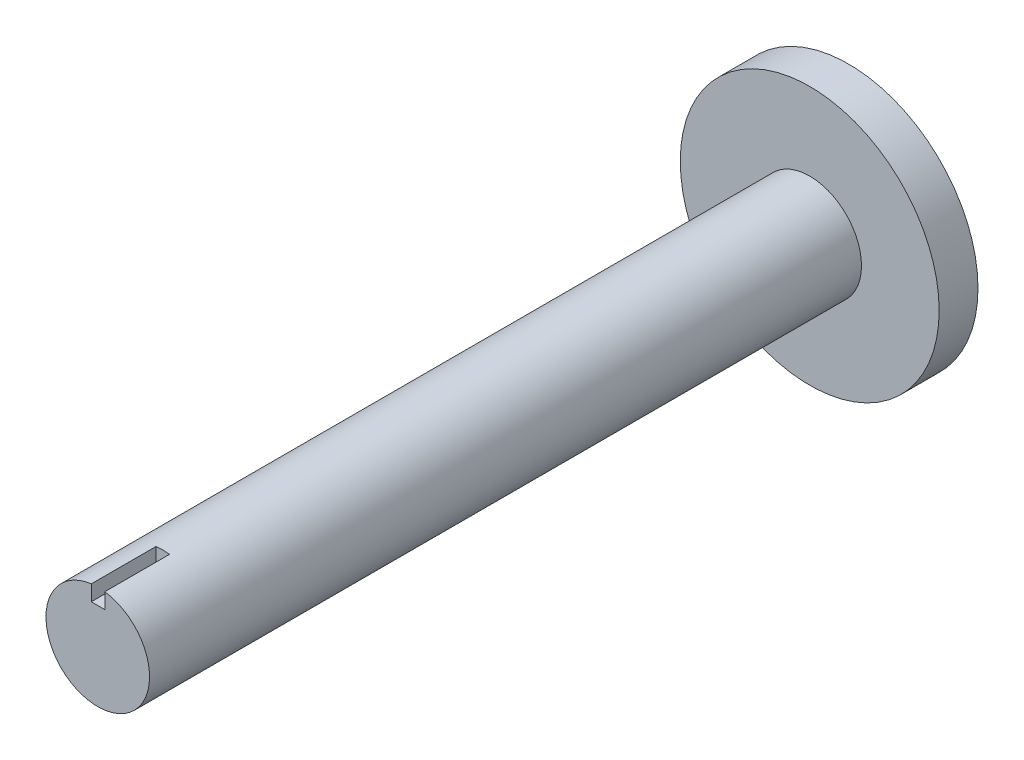
ISO-10303-21;
HEADER;
FILE_DESCRIPTION(('STEP AP214'),'2;1');
FILE_NAME('part.step','',(''),(''),'','','');
FILE_SCHEMA(('AUTOMOTIVE_DESIGN { 1 0 10303 214 1 1 1 1 }'));
ENDSEC;
DATA;
#1=APPLICATION_CONTEXT('core data for automotive mechanical design processes');
#2=APPLICATION_PROTOCOL_DEFINITION('international standard','automotive_design',2000,#1);
#3=PRODUCT_CONTEXT('',#1,'mechanical');
#4=PRODUCT('Part','Part','',(#3));
#5=PRODUCT_RELATED_PRODUCT_CATEGORY('part','',(#4));
#6=PRODUCT_DEFINITION_FORMATION('','',#4);
#7=PRODUCT_DEFINITION_CONTEXT('part definition',#1,'design');
#8=PRODUCT_DEFINITION('design','',#6,#7);
#9=PRODUCT_DEFINITION_SHAPE('','',#8);
#10=(LENGTH_UNIT() NAMED_UNIT(*) SI_UNIT(.MILLI.,.METRE.));
#11=(NAMED_UNIT(*) PLANE_ANGLE_UNIT() SI_UNIT($,.RADIAN.));
#12=(NAMED_UNIT(*) SI_UNIT($,.STERADIAN.) SOLID_ANGLE_UNIT());
#13=UNCERTAINTY_MEASURE_WITH_UNIT(LENGTH_MEASURE(1.E-05),#10,'distance_accuracy_value','');
#14=(GEOMETRIC_REPRESENTATION_CONTEXT(3) GLOBAL_UNCERTAINTY_ASSIGNED_CONTEXT((#13)) GLOBAL_UNIT_ASSIGNED_CONTEXT((#10,
#11,#12)) REPRESENTATION_CONTEXT('',''));
#15=CARTESIAN_POINT('',(0.,0.,0.));
#16=DIRECTION('',(0.,0.,1.));
#17=DIRECTION('',(1.,0.,0.));
#18=AXIS2_PLACEMENT_3D('',#15,#16,#17);
#19=CARTESIAN_POINT('',(0.,0.,58.));
#20=DIRECTION('',(0.,0.,-1.));
#21=DIRECTION('',(-1.,0.,0.));
#22=AXIS2_PLACEMENT_3D('',#19,#20,#21);
#23=CYLINDRICAL_SURFACE('',#22,4.);
#24=CARTESIAN_POINT('',(0.,0.,3.));
#25=DIRECTION('',(0.,0.,1.));
#26=DIRECTION('',(1.,0.,0.));
#27=AXIS2_PLACEMENT_3D('',#24,#25,#26);
#28=CIRCLE('',#27,4.);
#29=CARTESIAN_POINT('',(4.,0.,3.));
#30=VERTEX_POINT('',#29);
#31=EDGE_CURVE('E97',#30,#30,#28,.T.);
#32=ORIENTED_EDGE('',*,*,#31,.T.);
#33=EDGE_LOOP('',(#32));
#34=FACE_BOUND('',#33,.T.);
#35=DIRECTION('',(0.,0.,-1.));
#36=VECTOR('',#35,1.);
#37=CARTESIAN_POINT('',(-0.5,3.96862696659689,63.));
#38=LINE('',#37,#36);
#39=CARTESIAN_POINT('',(-0.5,3.96862696659689,58.));
#40=VERTEX_POINT('',#39);
#41=CARTESIAN_POINT('',(-0.5,3.96862696659689,53.));
#42=VERTEX_POINT('',#41);
#43=EDGE_CURVE('E55',#40,#42,#38,.T.);
#44=ORIENTED_EDGE('',*,*,#43,.T.);
#45=CARTESIAN_POINT('',(0.,0.,53.));
#46=DIRECTION('',(0.,0.,1.));
#47=DIRECTION('',(1.,0.,0.));
#48=AXIS2_PLACEMENT_3D('',#45,#46,#47);
#49=CIRCLE('',#48,4.);
#50=CARTESIAN_POINT('',(0.543300128970735,3.96293136073039,53.));
#51=VERTEX_POINT('',#50);
#52=EDGE_CURVE('E79',#51,#42,#49,.T.);
#53=ORIENTED_EDGE('',*,*,#52,.F.);
#54=DIRECTION('',(0.,0.,-1.));
#55=VECTOR('',#54,1.);
#56=CARTESIAN_POINT('',(0.543300128970735,3.96293136073039,63.));
#57=LINE('',#56,#55);
#58=CARTESIAN_POINT('',(0.543300128970735,3.96293136073039,58.));
#59=VERTEX_POINT('',#58);
#60=EDGE_CURVE('E113',#59,#51,#57,.T.);
#61=ORIENTED_EDGE('',*,*,#60,.F.);
#62=CARTESIAN_POINT('',(0.,0.,58.));
#63=DIRECTION('',(0.,0.,1.));
#64=DIRECTION('',(1.,0.,0.));
#65=AXIS2_PLACEMENT_3D('',#62,#63,#64);
#66=CIRCLE('',#65,4.);
#67=EDGE_CURVE('E90',#40,#59,#66,.T.);
#68=ORIENTED_EDGE('',*,*,#67,.F.);
#69=EDGE_LOOP('',(#44,#53,#61,#68));
#70=FACE_BOUND('',#69,.T.);
#71=ADVANCED_FACE('F32',(#34,#70),#23,.T.);
#72=CARTESIAN_POINT('',(0.,0.,58.));
#73=DIRECTION('',(0.,0.,1.));
#74=DIRECTION('',(1.,0.,0.));
#75=AXIS2_PLACEMENT_3D('',#72,#73,#74);
#76=PLANE('',#75);
#77=DIRECTION('',(-1.,0.,0.));
#78=VECTOR('',#77,1.);
#79=CARTESIAN_POINT('',(0.,2.76862696659689,58.));
#80=LINE('',#79,#78);
#81=CARTESIAN_POINT('',(0.543300128970735,2.76862696659689,58.));
#82=VERTEX_POINT('',#81);
#83=CARTESIAN_POINT('',(-0.5,2.76862696659689,58.));
#84=VERTEX_POINT('',#83);
#85=EDGE_CURVE('E40',#82,#84,#80,.T.);
#86=ORIENTED_EDGE('',*,*,#85,.T.);
#87=DIRECTION('',(0.,1.,0.));
#88=VECTOR('',#87,1.);
#89=CARTESIAN_POINT('',(-0.499999999999999,0.,58.));
#90=LINE('',#89,#88);
#91=EDGE_CURVE('E11',#84,#40,#90,.T.);
#92=ORIENTED_EDGE('',*,*,#91,.T.);
#93=ORIENTED_EDGE('',*,*,#67,.T.);
#94=DIRECTION('',(0.,-1.,0.));
#95=VECTOR('',#94,1.);
#96=CARTESIAN_POINT('',(0.543300128970734,0.,58.));
#97=LINE('',#96,#95);
#98=EDGE_CURVE('E100',#59,#82,#97,.T.);
#99=ORIENTED_EDGE('',*,*,#98,.T.);
#100=EDGE_LOOP('',(#86,#92,#93,#99));
#101=FACE_BOUND('',#100,.T.);
#102=ADVANCED_FACE('F109',(#101),#76,.T.);
#103=CARTESIAN_POINT('',(0.,0.,3.));
#104=DIRECTION('',(0.,0.,-1.));
#105=DIRECTION('',(-1.,0.,0.));
#106=AXIS2_PLACEMENT_3D('',#103,#104,#105);
#107=CYLINDRICAL_SURFACE('',#106,10.);
#108=CARTESIAN_POINT('',(0.,0.,3.));
#109=DIRECTION('',(0.,0.,1.));
#110=DIRECTION('',(1.,0.,0.));
#111=AXIS2_PLACEMENT_3D('',#108,#109,#110);
#112=CIRCLE('',#111,10.);
#113=CARTESIAN_POINT('',(10.,0.,3.));
#114=VERTEX_POINT('',#113);
#115=EDGE_CURVE('E101',#114,#114,#112,.T.);
#116=ORIENTED_EDGE('',*,*,#115,.F.);
#117=EDGE_LOOP('',(#116));
#118=FACE_BOUND('',#117,.T.);
#119=CARTESIAN_POINT('',(0.,0.,0.));
#120=DIRECTION('',(0.,0.,1.));
#121=DIRECTION('',(1.,0.,0.));
#122=AXIS2_PLACEMENT_3D('',#119,#120,#121);
#123=CIRCLE('',#122,10.);
#124=CARTESIAN_POINT('',(10.,0.,0.));
#125=VERTEX_POINT('',#124);
#126=EDGE_CURVE('E92',#125,#125,#123,.T.);
#127=ORIENTED_EDGE('',*,*,#126,.T.);
#128=EDGE_LOOP('',(#127));
#129=FACE_BOUND('',#128,.T.);
#130=ADVANCED_FACE('F34',(#118,#129),#107,.T.);
#131=CARTESIAN_POINT('',(0.,0.,3.));
#132=DIRECTION('',(0.,0.,1.));
#133=DIRECTION('',(1.,0.,0.));
#134=AXIS2_PLACEMENT_3D('',#131,#132,#133);
#135=PLANE('',#134);
#136=ORIENTED_EDGE('',*,*,#31,.F.);
#137=EDGE_LOOP('',(#136));
#138=FACE_BOUND('',#137,.T.);
#139=ORIENTED_EDGE('',*,*,#115,.T.);
#140=EDGE_LOOP('',(#139));
#141=FACE_BOUND('',#140,.T.);
#142=ADVANCED_FACE('F134',(#138,#141),#135,.T.);
#143=CARTESIAN_POINT('',(0.,0.,0.));
#144=DIRECTION('',(0.,0.,1.));
#145=DIRECTION('',(1.,0.,0.));
#146=AXIS2_PLACEMENT_3D('',#143,#144,#145);
#147=PLANE('',#146);
#148=ORIENTED_EDGE('',*,*,#126,.F.);
#149=EDGE_LOOP('',(#148));
#150=FACE_BOUND('',#149,.T.);
#151=ADVANCED_FACE('F136',(#150),#147,.F.);
#152=CARTESIAN_POINT('',(-0.5,3.96862696659689,63.));
#153=DIRECTION('',(1.,0.,0.));
#154=DIRECTION('',(0.,1.,0.));
#155=AXIS2_PLACEMENT_3D('',#152,#153,#154);
#156=PLANE('',#155);
#157=DIRECTION('',(0.,0.,-1.));
#158=VECTOR('',#157,1.);
#159=CARTESIAN_POINT('',(-0.5,2.76862696659689,63.));
#160=LINE('',#159,#158);
#161=CARTESIAN_POINT('',(-0.5,2.76862696659689,53.));
#162=VERTEX_POINT('',#161);
#163=EDGE_CURVE('E74',#84,#162,#160,.T.);
#164=ORIENTED_EDGE('',*,*,#163,.T.);
#165=DIRECTION('',(0.,-1.,0.));
#166=VECTOR('',#165,1.);
#167=CARTESIAN_POINT('',(-0.5,3.96862696659689,53.));
#168=LINE('',#167,#166);
#169=EDGE_CURVE('E70',#42,#162,#168,.T.);
#170=ORIENTED_EDGE('',*,*,#169,.F.);
#171=ORIENTED_EDGE('',*,*,#43,.F.);
#172=ORIENTED_EDGE('',*,*,#91,.F.);
#173=EDGE_LOOP('',(#164,#170,#171,#172));
#174=FACE_BOUND('',#173,.T.);
#175=ADVANCED_FACE('F72',(#174),#156,.T.);
#176=CARTESIAN_POINT('',(-0.5,2.76862696659689,63.));
#177=DIRECTION('',(0.,1.,0.));
#178=DIRECTION('',(0.,0.,1.));
#179=AXIS2_PLACEMENT_3D('',#176,#177,#178);
#180=PLANE('',#179);
#181=DIRECTION('',(0.,0.,-1.));
#182=VECTOR('',#181,1.);
#183=CARTESIAN_POINT('',(0.543300128970735,2.76862696659689,63.));
#184=LINE('',#183,#182);
#185=CARTESIAN_POINT('',(0.543300128970735,2.76862696659689,53.));
#186=VERTEX_POINT('',#185);
#187=EDGE_CURVE('E47',#82,#186,#184,.T.);
#188=ORIENTED_EDGE('',*,*,#187,.T.);
#189=DIRECTION('',(1.,0.,0.));
#190=VECTOR('',#189,1.);
#191=CARTESIAN_POINT('',(-0.5,2.76862696659689,53.));
#192=LINE('',#191,#190);
#193=EDGE_CURVE('E78',#162,#186,#192,.T.);
#194=ORIENTED_EDGE('',*,*,#193,.F.);
#195=ORIENTED_EDGE('',*,*,#163,.F.);
#196=ORIENTED_EDGE('',*,*,#85,.F.);
#197=EDGE_LOOP('',(#188,#194,#195,#196));
#198=FACE_BOUND('',#197,.T.);
#199=ADVANCED_FACE('F111',(#198),#180,.T.);
#200=CARTESIAN_POINT('',(0.543300128970735,2.76862696659689,63.));
#201=DIRECTION('',(-1.,0.,0.));
#202=DIRECTION('',(0.,-1.,0.));
#203=AXIS2_PLACEMENT_3D('',#200,#201,#202);
#204=PLANE('',#203);
#205=ORIENTED_EDGE('',*,*,#60,.T.);
#206=DIRECTION('',(0.,1.,0.));
#207=VECTOR('',#206,1.);
#208=CARTESIAN_POINT('',(0.543300128970735,2.76862696659689,53.));
#209=LINE('',#208,#207);
#210=EDGE_CURVE('E84',#186,#51,#209,.T.);
#211=ORIENTED_EDGE('',*,*,#210,.F.);
#212=ORIENTED_EDGE('',*,*,#187,.F.);
#213=ORIENTED_EDGE('',*,*,#98,.F.);
#214=EDGE_LOOP('',(#205,#211,#212,#213));
#215=FACE_BOUND('',#214,.T.);
#216=ADVANCED_FACE('F116',(#215),#204,.T.);
#217=CARTESIAN_POINT('',(0.,0.,53.));
#218=DIRECTION('',(0.,0.,1.));
#219=DIRECTION('',(1.,0.,0.));
#220=AXIS2_PLACEMENT_3D('',#217,#218,#219);
#221=PLANE('',#220);
#222=ORIENTED_EDGE('',*,*,#52,.T.);
#223=ORIENTED_EDGE('',*,*,#169,.T.);
#224=ORIENTED_EDGE('',*,*,#193,.T.);
#225=ORIENTED_EDGE('',*,*,#210,.T.);
#226=EDGE_LOOP('',(#222,#223,#224,#225));
#227=FACE_BOUND('',#226,.T.);
#228=ADVANCED_FACE('F83',(#227),#221,.T.);
#229=CLOSED_SHELL('',(#71,#102,#130,#142,#151,#175,#199,#216,#228));
#230=MANIFOLD_SOLID_BREP('B2',#229);
#231=ADVANCED_BREP_SHAPE_REPRESENTATION('',(#18,#230),#14);
#232=SHAPE_DEFINITION_REPRESENTATION(#9,#231);
ENDSEC;
END-ISO-10303-21;
